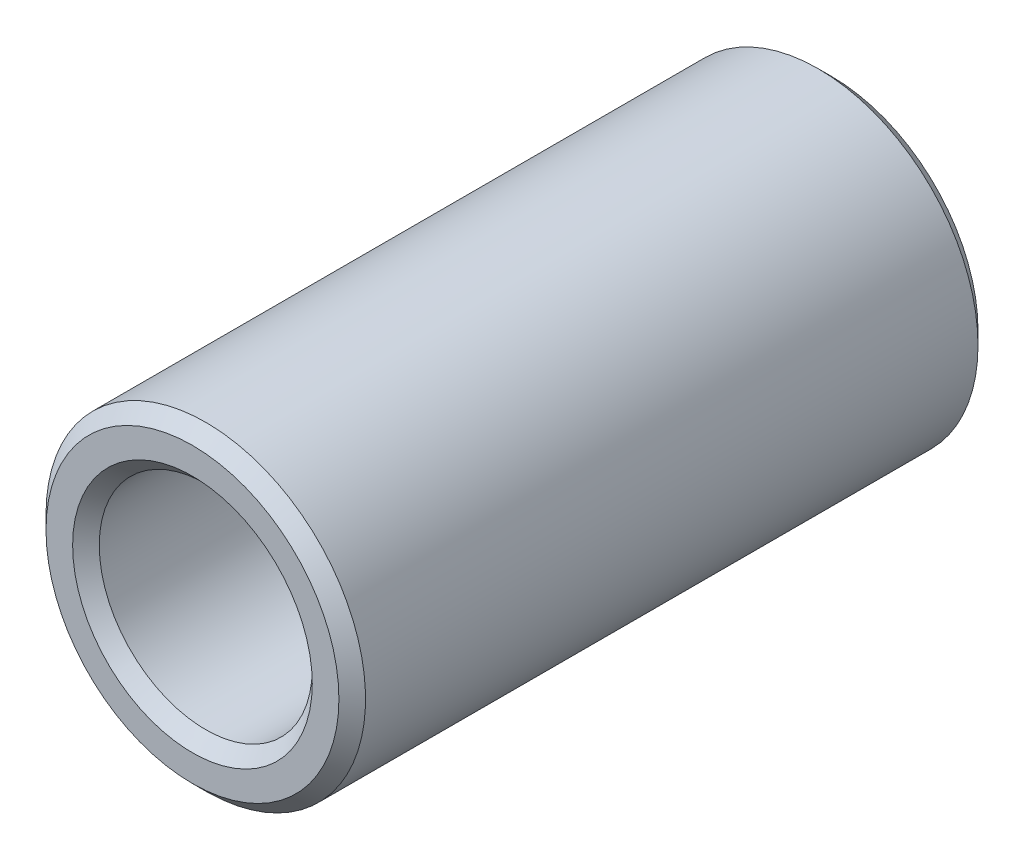
ISO-10303-21;
HEADER;
FILE_DESCRIPTION(('STEP AP214'),'2;1');
FILE_NAME('part.step','',(''),(''),'','','');
FILE_SCHEMA(('AUTOMOTIVE_DESIGN { 1 0 10303 214 1 1 1 1 }'));
ENDSEC;
DATA;
#1=APPLICATION_CONTEXT('core data for automotive mechanical design processes');
#2=APPLICATION_PROTOCOL_DEFINITION('international standard','automotive_design',2000,#1);
#3=PRODUCT_CONTEXT('',#1,'mechanical');
#4=PRODUCT('Part','Part','',(#3));
#5=PRODUCT_RELATED_PRODUCT_CATEGORY('part','',(#4));
#6=PRODUCT_DEFINITION_FORMATION('','',#4);
#7=PRODUCT_DEFINITION_CONTEXT('part definition',#1,'design');
#8=PRODUCT_DEFINITION('design','',#6,#7);
#9=PRODUCT_DEFINITION_SHAPE('','',#8);
#10=(LENGTH_UNIT() NAMED_UNIT(*) SI_UNIT(.MILLI.,.METRE.));
#11=(NAMED_UNIT(*) PLANE_ANGLE_UNIT() SI_UNIT($,.RADIAN.));
#12=(NAMED_UNIT(*) SI_UNIT($,.STERADIAN.) SOLID_ANGLE_UNIT());
#13=UNCERTAINTY_MEASURE_WITH_UNIT(LENGTH_MEASURE(1.E-05),#10,'distance_accuracy_value','');
#14=(GEOMETRIC_REPRESENTATION_CONTEXT(3) GLOBAL_UNCERTAINTY_ASSIGNED_CONTEXT((#13)) GLOBAL_UNIT_ASSIGNED_CONTEXT((#10,
#11,#12)) REPRESENTATION_CONTEXT('',''));
#15=CARTESIAN_POINT('',(0.,0.,0.));
#16=DIRECTION('',(0.,0.,1.));
#17=DIRECTION('',(1.,0.,0.));
#18=AXIS2_PLACEMENT_3D('',#15,#16,#17);
#19=CARTESIAN_POINT('',(0.,0.,-11.5));
#20=DIRECTION('',(0.,0.,-1.));
#21=DIRECTION('',(-1.,0.,0.));
#22=AXIS2_PLACEMENT_3D('',#19,#20,#21);
#23=CONICAL_SURFACE('',#22,4.,0.785398163397448);
#24=CARTESIAN_POINT('',(0.,0.,-11.5));
#25=DIRECTION('',(0.,0.,-1.));
#26=DIRECTION('',(-1.,0.,0.));
#27=AXIS2_PLACEMENT_3D('',#24,#25,#26);
#28=CIRCLE('',#27,4.);
#29=CARTESIAN_POINT('',(-4.,0.,-11.5));
#30=VERTEX_POINT('',#29);
#31=EDGE_CURVE('E32',#30,#30,#28,.T.);
#32=ORIENTED_EDGE('',*,*,#31,.F.);
#33=EDGE_LOOP('',(#32));
#34=FACE_BOUND('',#33,.T.);
#35=CARTESIAN_POINT('',(0.,0.,-12.));
#36=DIRECTION('',(0.,0.,-1.));
#37=DIRECTION('',(-1.,0.,0.));
#38=AXIS2_PLACEMENT_3D('',#35,#36,#37);
#39=CIRCLE('',#38,4.50000000000001);
#40=CARTESIAN_POINT('',(-4.50000000000001,0.,-12.));
#41=VERTEX_POINT('',#40);
#42=EDGE_CURVE('E19',#41,#41,#39,.T.);
#43=ORIENTED_EDGE('',*,*,#42,.T.);
#44=EDGE_LOOP('',(#43));
#45=FACE_BOUND('',#44,.T.);
#46=ADVANCED_FACE('F15',(#34,#45),#23,.F.);
#47=CARTESIAN_POINT('',(-5.566,-5.566,-12.));
#48=DIRECTION('',(0.,0.,1.));
#49=DIRECTION('',(1.,0.,0.));
#50=AXIS2_PLACEMENT_3D('',#47,#48,#49);
#51=PLANE('',#50);
#52=ORIENTED_EDGE('',*,*,#42,.F.);
#53=EDGE_LOOP('',(#52));
#54=FACE_BOUND('',#53,.T.);
#55=CARTESIAN_POINT('',(0.,0.,-12.));
#56=DIRECTION('',(0.,0.,1.));
#57=DIRECTION('',(1.,0.,0.));
#58=AXIS2_PLACEMENT_3D('',#55,#56,#57);
#59=CIRCLE('',#58,5.49999999999999);
#60=CARTESIAN_POINT('',(5.49999999999999,0.,-12.));
#61=VERTEX_POINT('',#60);
#62=EDGE_CURVE('E36',#61,#61,#59,.F.);
#63=ORIENTED_EDGE('',*,*,#62,.T.);
#64=EDGE_LOOP('',(#63));
#65=FACE_BOUND('',#64,.T.);
#66=ADVANCED_FACE('F50',(#54,#65),#51,.F.);
#67=CARTESIAN_POINT('',(0.,0.,11.5));
#68=DIRECTION('',(0.,0.,-1.));
#69=DIRECTION('',(-1.,0.,0.));
#70=AXIS2_PLACEMENT_3D('',#67,#68,#69);
#71=CYLINDRICAL_SURFACE('',#70,4.);
#72=CARTESIAN_POINT('',(0.,0.,11.5));
#73=DIRECTION('',(0.,0.,1.));
#74=DIRECTION('',(1.,0.,0.));
#75=AXIS2_PLACEMENT_3D('',#72,#73,#74);
#76=CIRCLE('',#75,4.);
#77=CARTESIAN_POINT('',(4.,0.,11.5));
#78=VERTEX_POINT('',#77);
#79=EDGE_CURVE('E38',#78,#78,#76,.F.);
#80=ORIENTED_EDGE('',*,*,#79,.F.);
#81=EDGE_LOOP('',(#80));
#82=FACE_BOUND('',#81,.T.);
#83=ORIENTED_EDGE('',*,*,#31,.T.);
#84=EDGE_LOOP('',(#83));
#85=FACE_BOUND('',#84,.T.);
#86=ADVANCED_FACE('F52',(#82,#85),#71,.F.);
#87=CARTESIAN_POINT('',(0.,0.,-12.));
#88=DIRECTION('',(0.,0.,1.));
#89=DIRECTION('',(1.,0.,0.));
#90=AXIS2_PLACEMENT_3D('',#87,#88,#89);
#91=CONICAL_SURFACE('',#90,5.5,0.785398163397448);
#92=CARTESIAN_POINT('',(0.,0.,-11.5));
#93=DIRECTION('',(0.,0.,-1.));
#94=DIRECTION('',(-1.,0.,0.));
#95=AXIS2_PLACEMENT_3D('',#92,#93,#94);
#96=CIRCLE('',#95,6.);
#97=CARTESIAN_POINT('',(-6.,0.,-11.5));
#98=VERTEX_POINT('',#97);
#99=EDGE_CURVE('E35',#98,#98,#96,.T.);
#100=ORIENTED_EDGE('',*,*,#99,.T.);
#101=EDGE_LOOP('',(#100));
#102=FACE_BOUND('',#101,.T.);
#103=ORIENTED_EDGE('',*,*,#62,.F.);
#104=EDGE_LOOP('',(#103));
#105=FACE_BOUND('',#104,.T.);
#106=ADVANCED_FACE('F58',(#102,#105),#91,.T.);
#107=CARTESIAN_POINT('',(0.,0.,11.5));
#108=DIRECTION('',(0.,0.,1.));
#109=DIRECTION('',(1.,0.,0.));
#110=AXIS2_PLACEMENT_3D('',#107,#108,#109);
#111=CONICAL_SURFACE('',#110,4.,0.785398163397448);
#112=ORIENTED_EDGE('',*,*,#79,.T.);
#113=EDGE_LOOP('',(#112));
#114=FACE_BOUND('',#113,.T.);
#115=CARTESIAN_POINT('',(0.,0.,11.9999999999999));
#116=DIRECTION('',(0.,0.,1.));
#117=DIRECTION('',(1.,0.,0.));
#118=AXIS2_PLACEMENT_3D('',#115,#116,#117);
#119=CIRCLE('',#118,4.4999999999999);
#120=CARTESIAN_POINT('',(4.4999999999999,0.,11.9999999999999));
#121=VERTEX_POINT('',#120);
#122=EDGE_CURVE('E28',#121,#121,#119,.F.);
#123=ORIENTED_EDGE('',*,*,#122,.F.);
#124=EDGE_LOOP('',(#123));
#125=FACE_BOUND('',#124,.T.);
#126=ADVANCED_FACE('F76',(#114,#125),#111,.F.);
#127=CARTESIAN_POINT('',(0.,0.,11.5));
#128=DIRECTION('',(0.,0.,-1.));
#129=DIRECTION('',(-1.,0.,0.));
#130=AXIS2_PLACEMENT_3D('',#127,#128,#129);
#131=CYLINDRICAL_SURFACE('',#130,6.);
#132=ORIENTED_EDGE('',*,*,#99,.F.);
#133=EDGE_LOOP('',(#132));
#134=FACE_BOUND('',#133,.T.);
#135=CARTESIAN_POINT('',(0.,0.,11.5000000000001));
#136=DIRECTION('',(0.,0.,-1.));
#137=DIRECTION('',(-1.,0.,0.));
#138=AXIS2_PLACEMENT_3D('',#135,#136,#137);
#139=CIRCLE('',#138,6.);
#140=CARTESIAN_POINT('',(-6.,0.,11.5));
#141=VERTEX_POINT('',#140);
#142=EDGE_CURVE('E23',#141,#141,#139,.T.);
#143=ORIENTED_EDGE('',*,*,#142,.T.);
#144=EDGE_LOOP('',(#143));
#145=FACE_BOUND('',#144,.T.);
#146=ADVANCED_FACE('F70',(#134,#145),#131,.T.);
#147=CARTESIAN_POINT('',(-5.566,-5.566,12.));
#148=DIRECTION('',(0.,0.,1.));
#149=DIRECTION('',(1.,0.,0.));
#150=AXIS2_PLACEMENT_3D('',#147,#148,#149);
#151=PLANE('',#150);
#152=ORIENTED_EDGE('',*,*,#122,.T.);
#153=EDGE_LOOP('',(#152));
#154=FACE_BOUND('',#153,.T.);
#155=CARTESIAN_POINT('',(0.,0.,12.));
#156=DIRECTION('',(0.,0.,-1.));
#157=DIRECTION('',(-1.,0.,0.));
#158=AXIS2_PLACEMENT_3D('',#155,#156,#157);
#159=CIRCLE('',#158,5.49999999999999);
#160=CARTESIAN_POINT('',(-5.49999999999999,0.,12.));
#161=VERTEX_POINT('',#160);
#162=EDGE_CURVE('E10',#161,#161,#159,.F.);
#163=ORIENTED_EDGE('',*,*,#162,.T.);
#164=EDGE_LOOP('',(#163));
#165=FACE_BOUND('',#164,.T.);
#166=ADVANCED_FACE('F17',(#154,#165),#151,.T.);
#167=CARTESIAN_POINT('',(0.,0.,12.));
#168=DIRECTION('',(0.,0.,-1.));
#169=DIRECTION('',(-1.,0.,0.));
#170=AXIS2_PLACEMENT_3D('',#167,#168,#169);
#171=CONICAL_SURFACE('',#170,5.5,0.785398163397448);
#172=ORIENTED_EDGE('',*,*,#162,.F.);
#173=EDGE_LOOP('',(#172));
#174=FACE_BOUND('',#173,.T.);
#175=ORIENTED_EDGE('',*,*,#142,.F.);
#176=EDGE_LOOP('',(#175));
#177=FACE_BOUND('',#176,.T.);
#178=ADVANCED_FACE('F63',(#174,#177),#171,.T.);
#179=CLOSED_SHELL('',(#46,#66,#86,#106,#126,#146,#166,#178));
#180=MANIFOLD_SOLID_BREP('B1',#179);
#181=ADVANCED_BREP_SHAPE_REPRESENTATION('',(#18,#180),#14);
#182=SHAPE_DEFINITION_REPRESENTATION(#9,#181);
ENDSEC;
END-ISO-10303-21;
